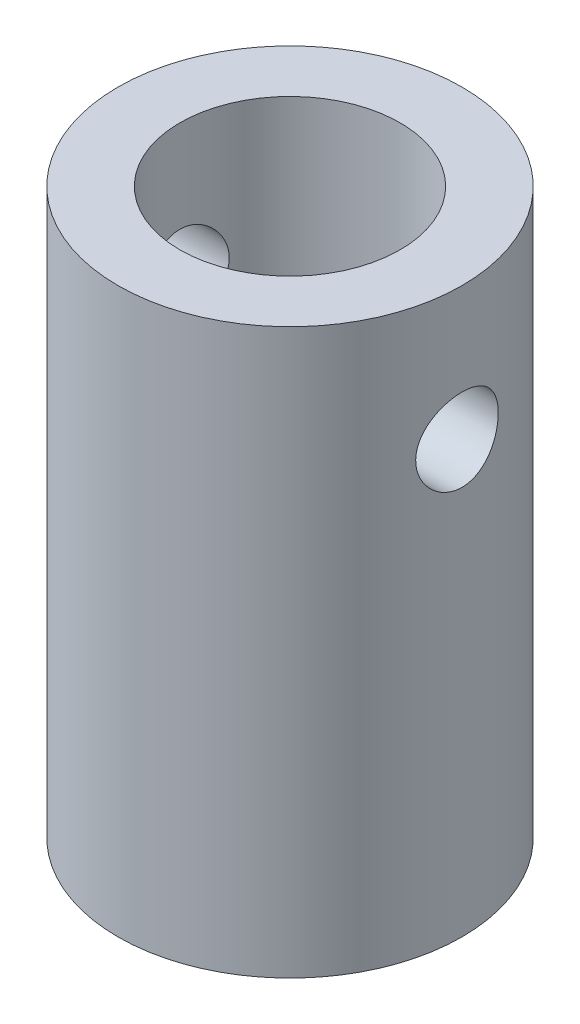
ISO-10303-21;
HEADER;
FILE_DESCRIPTION(('STEP AP214'),'2;1');
FILE_NAME('part.step','',(''),(''),'','','');
FILE_SCHEMA(('AUTOMOTIVE_DESIGN { 1 0 10303 214 1 1 1 1 }'));
ENDSEC;
DATA;
#1=APPLICATION_CONTEXT('core data for automotive mechanical design processes');
#2=APPLICATION_PROTOCOL_DEFINITION('international standard','automotive_design',2000,#1);
#3=PRODUCT_CONTEXT('',#1,'mechanical');
#4=PRODUCT('Part','Part','',(#3));
#5=PRODUCT_RELATED_PRODUCT_CATEGORY('part','',(#4));
#6=PRODUCT_DEFINITION_FORMATION('','',#4);
#7=PRODUCT_DEFINITION_CONTEXT('part definition',#1,'design');
#8=PRODUCT_DEFINITION('design','',#6,#7);
#9=PRODUCT_DEFINITION_SHAPE('','',#8);
#10=(LENGTH_UNIT() NAMED_UNIT(*) SI_UNIT(.MILLI.,.METRE.));
#11=(NAMED_UNIT(*) PLANE_ANGLE_UNIT() SI_UNIT($,.RADIAN.));
#12=(NAMED_UNIT(*) SI_UNIT($,.STERADIAN.) SOLID_ANGLE_UNIT());
#13=UNCERTAINTY_MEASURE_WITH_UNIT(LENGTH_MEASURE(1.E-05),#10,'distance_accuracy_value','');
#14=(GEOMETRIC_REPRESENTATION_CONTEXT(3) GLOBAL_UNCERTAINTY_ASSIGNED_CONTEXT((#13)) GLOBAL_UNIT_ASSIGNED_CONTEXT((#10,
#11,#12)) REPRESENTATION_CONTEXT('',''));
#15=CARTESIAN_POINT('',(0.,0.,0.));
#16=DIRECTION('',(0.,0.,1.));
#17=DIRECTION('',(1.,0.,0.));
#18=AXIS2_PLACEMENT_3D('',#15,#16,#17);
#19=CARTESIAN_POINT('',(0.,41.,0.));
#20=DIRECTION('',(0.,1.,0.));
#21=DIRECTION('',(0.,0.,1.));
#22=AXIS2_PLACEMENT_3D('',#19,#20,#21);
#23=PLANE('',#22);
#24=CARTESIAN_POINT('',(0.,41.,0.));
#25=DIRECTION('',(0.,1.,0.));
#26=DIRECTION('',(0.,0.,1.));
#27=AXIS2_PLACEMENT_3D('',#24,#25,#26);
#28=CIRCLE('',#27,12.5);
#29=CARTESIAN_POINT('',(0.,41.,12.5));
#30=VERTEX_POINT('',#29);
#31=EDGE_CURVE('E10',#30,#30,#28,.T.);
#32=ORIENTED_EDGE('',*,*,#31,.T.);
#33=EDGE_LOOP('',(#32));
#34=FACE_BOUND('',#33,.T.);
#35=CARTESIAN_POINT('',(0.,41.,0.));
#36=DIRECTION('',(0.,1.,0.));
#37=DIRECTION('',(0.,0.,1.));
#38=AXIS2_PLACEMENT_3D('',#35,#36,#37);
#39=CIRCLE('',#38,8.001);
#40=CARTESIAN_POINT('',(0.,41.,8.001));
#41=VERTEX_POINT('',#40);
#42=EDGE_CURVE('E51',#41,#41,#39,.T.);
#43=ORIENTED_EDGE('',*,*,#42,.F.);
#44=EDGE_LOOP('',(#43));
#45=FACE_BOUND('',#44,.T.);
#46=ADVANCED_FACE('F32',(#34,#45),#23,.T.);
#47=CARTESIAN_POINT('',(0.,0.,0.));
#48=DIRECTION('',(0.,1.,0.));
#49=DIRECTION('',(0.,0.,1.));
#50=AXIS2_PLACEMENT_3D('',#47,#48,#49);
#51=PLANE('',#50);
#52=CARTESIAN_POINT('',(0.,0.,0.));
#53=DIRECTION('',(0.,1.,0.));
#54=DIRECTION('',(0.,0.,1.));
#55=AXIS2_PLACEMENT_3D('',#52,#53,#54);
#56=CIRCLE('',#55,12.5);
#57=CARTESIAN_POINT('',(0.,0.,12.5));
#58=VERTEX_POINT('',#57);
#59=EDGE_CURVE('E46',#58,#58,#56,.T.);
#60=ORIENTED_EDGE('',*,*,#59,.F.);
#61=EDGE_LOOP('',(#60));
#62=FACE_BOUND('',#61,.T.);
#63=CARTESIAN_POINT('',(0.,0.,0.));
#64=DIRECTION('',(0.,1.,0.));
#65=DIRECTION('',(0.,0.,1.));
#66=AXIS2_PLACEMENT_3D('',#63,#64,#65);
#67=CIRCLE('',#66,8.001);
#68=CARTESIAN_POINT('',(0.,0.,8.001));
#69=VERTEX_POINT('',#68);
#70=EDGE_CURVE('E54',#69,#69,#67,.T.);
#71=ORIENTED_EDGE('',*,*,#70,.T.);
#72=EDGE_LOOP('',(#71));
#73=FACE_BOUND('',#72,.T.);
#74=ADVANCED_FACE('F90',(#62,#73),#51,.F.);
#75=CARTESIAN_POINT('',(0.,41.,0.));
#76=DIRECTION('',(0.,-1.,0.));
#77=DIRECTION('',(0.,0.,-1.));
#78=AXIS2_PLACEMENT_3D('',#75,#76,#77);
#79=CYLINDRICAL_SURFACE('',#78,12.5);
#80=CARTESIAN_POINT('',(-12.5,28.3,0.));
#81=CARTESIAN_POINT('',(-12.4999970714968,28.3000050240773,-0.165963929028716));
#82=CARTESIAN_POINT('',(-12.4966615634859,28.3138184102361,-0.331985420928067));
#83=CARTESIAN_POINT('',(-12.4836783946933,28.3686327395954,-0.65928429097138));
#84=CARTESIAN_POINT('',(-12.4740268462166,28.4096504279947,-0.820558683214275));
#85=CARTESIAN_POINT('',(-12.4494823208195,28.5174923345044,-1.13358839471402));
#86=CARTESIAN_POINT('',(-12.4345953702841,28.5842868898576,-1.28535442324823));
#87=CARTESIAN_POINT('',(-12.4011725442513,28.7416854364459,-1.57552517879763));
#88=CARTESIAN_POINT('',(-12.3826366165873,28.8322897680773,-1.71392971475166));
#89=CARTESIAN_POINT('',(-12.3435386014785,29.0365641783755,-1.97609263393972));
#90=CARTESIAN_POINT('',(-12.3229472454311,29.1506027810493,-2.0995595210048));
#91=CARTESIAN_POINT('',(-12.2822574370147,29.3977188690646,-2.32581080811943));
#92=CARTESIAN_POINT('',(-12.2621590363612,29.530798342041,-2.42859304624489));
#93=CARTESIAN_POINT('',(-12.224437969062,29.8144458330175,-2.61189993555015));
#94=CARTESIAN_POINT('',(-12.2068525815312,29.9652265837588,-2.69210377047565));
#95=CARTESIAN_POINT('',(-12.1765733412448,30.2786198351285,-2.82591582947333));
#96=CARTESIAN_POINT('',(-12.1638787734309,30.4412306020232,-2.87952794169564));
#97=CARTESIAN_POINT('',(-12.1451184675007,30.7704765732689,-2.95765058108663));
#98=CARTESIAN_POINT('',(-12.1389341034343,30.9369811215255,-2.98268262400617));
#99=CARTESIAN_POINT('',(-12.1335389605945,31.2719323796427,-3.00455808879087));
#100=CARTESIAN_POINT('',(-12.1343271412568,31.4403787959569,-3.00140571682399));
#101=CARTESIAN_POINT('',(-12.1426811387008,31.7704759660129,-2.96741912081942));
#102=CARTESIAN_POINT('',(-12.1500960921292,31.9321945651896,-2.93720103400494));
#103=CARTESIAN_POINT('',(-12.1706283738785,32.2481973166478,-2.85092141637189));
#104=CARTESIAN_POINT('',(-12.1837460799133,32.4024809757344,-2.79485817372027));
#105=CARTESIAN_POINT('',(-12.2143476734445,32.7009129780844,-2.65794121231782));
#106=CARTESIAN_POINT('',(-12.2318714325758,32.8449524529167,-2.5768594824696));
#107=CARTESIAN_POINT('',(-12.2692875046197,33.1176045007226,-2.39236688956383));
#108=CARTESIAN_POINT('',(-12.2891802016137,33.2462145652851,-2.28895240342647));
#109=CARTESIAN_POINT('',(-12.329732025739,33.4878935703187,-2.05951493908847));
#110=CARTESIAN_POINT('',(-12.3503975788014,33.6004670990622,-1.93297064389908));
#111=CARTESIAN_POINT('',(-12.3896951594929,33.8028847197464,-1.66255592459692));
#112=CARTESIAN_POINT('',(-12.4083271342049,33.8927282202926,-1.51868504982141));
#113=CARTESIAN_POINT('',(-12.4415394956922,34.0472972206128,-1.21702847718581));
#114=CARTESIAN_POINT('',(-12.4561077058019,34.1119474562378,-1.05920278696054));
#115=CARTESIAN_POINT('',(-12.4794620474154,34.2136650790486,-0.734497606078677));
#116=CARTESIAN_POINT('',(-12.4882491958651,34.2507373176268,-0.567619713387664));
#117=CARTESIAN_POINT('',(-12.4989027542709,34.295502064652,-0.233787399651668));
#118=CARTESIAN_POINT('',(-12.5009282130753,34.3038698924616,-0.0669284805450108));
#119=CARTESIAN_POINT('',(-12.4982807419474,34.2928332331491,0.265804381586626));
#120=CARTESIAN_POINT('',(-12.4936083648176,34.2734310380128,0.43167840476495));
#121=CARTESIAN_POINT('',(-12.4781916395217,34.2079630214836,0.755422580108844));
#122=CARTESIAN_POINT('',(-12.4675301590363,34.1622608904262,0.9133705793113));
#123=CARTESIAN_POINT('',(-12.4413335015664,34.0459018083047,1.21935330013476));
#124=CARTESIAN_POINT('',(-12.4257978558334,33.9752424570219,1.3673870666415));
#125=CARTESIAN_POINT('',(-12.3911910149582,33.8096334064022,1.6520615099557));
#126=CARTESIAN_POINT('',(-12.3720653178033,33.7142992830756,1.78847176740355));
#127=CARTESIAN_POINT('',(-12.3324936406987,33.5025430709866,2.04359904096632));
#128=CARTESIAN_POINT('',(-12.3120474520734,33.3861176439192,2.16231325074336));
#129=CARTESIAN_POINT('',(-12.2715742142771,33.1323591687915,2.38142453789941));
#130=CARTESIAN_POINT('',(-12.2515669262668,32.9946148779179,2.48134974047369));
#131=CARTESIAN_POINT('',(-12.2147538797452,32.7039095721033,2.65666020824081));
#132=CARTESIAN_POINT('',(-12.1979479778962,32.5509492389065,2.7320465722335));
#133=CARTESIAN_POINT('',(-12.1696189519335,32.234987486456,2.85558993518171));
#134=CARTESIAN_POINT('',(-12.1580647463107,32.0720517965788,2.90390754385905));
#135=CARTESIAN_POINT('',(-12.1415072663683,31.7400538149793,2.97238380283979));
#136=CARTESIAN_POINT('',(-12.1365026916888,31.5709927462382,2.99254804274991));
#137=CARTESIAN_POINT('',(-12.1337046220624,31.2363292997194,3.00387066449353));
#138=CARTESIAN_POINT('',(-12.1357241633848,31.0707535036733,2.99578106592266));
#139=CARTESIAN_POINT('',(-12.1463176460425,30.7434002357763,2.95253345626268));
#140=CARTESIAN_POINT('',(-12.1548914750658,30.5816226988886,2.91737590900097));
#141=CARTESIAN_POINT('',(-12.1775274976748,30.2672024474518,2.82138591303537));
#142=CARTESIAN_POINT('',(-12.191561756094,30.1145177274162,2.76068402045612));
#143=CARTESIAN_POINT('',(-12.2235433612686,29.8213955861163,2.61543373580583));
#144=CARTESIAN_POINT('',(-12.2414912075257,29.6809597314136,2.53088229934855));
#145=CARTESIAN_POINT('',(-12.279819325529,29.4126629998805,2.33793007708464));
#146=CARTESIAN_POINT('',(-12.3002478697533,29.2851876769013,2.22900267979018));
#147=CARTESIAN_POINT('',(-12.3409359831145,29.0500800119481,1.99143074773237));
#148=CARTESIAN_POINT('',(-12.361195511444,28.9424523367898,1.86278158874234));
#149=CARTESIAN_POINT('',(-12.3996570299581,28.7483907404453,1.5868829988014));
#150=CARTESIAN_POINT('',(-12.4178200201219,28.662331594558,1.43936414359402));
#151=CARTESIAN_POINT('',(-12.4496380610582,28.5163704672521,1.13153622828568));
#152=CARTESIAN_POINT('',(-12.4632965272855,28.4564486566084,0.971236973691226));
#153=CARTESIAN_POINT('',(-12.4824059901497,28.3739613748622,0.675887025694772));
#154=CARTESIAN_POINT('',(-12.4889599449579,28.3462833842143,0.542312066268428));
#155=CARTESIAN_POINT('',(-12.4977580149525,28.3093012191481,0.272504227478253));
#156=CARTESIAN_POINT('',(-12.5000024045682,28.2999958747745,0.136271517915779));
#157=CARTESIAN_POINT('',(-12.5,28.3,0.));
#158=B_SPLINE_CURVE_WITH_KNOTS('',3,(#80,#81,#82,#83,#84,#85,#86,#87,#88,#89,#90,#91,#92,#93,
#94,#95,#96,#97,#98,#99,#100,#101,#102,#103,#104,#105,#106,#107,#108,#109,#110,#111,#112,#113,
#114,#115,#116,#117,#118,#119,#120,#121,#122,#123,#124,#125,#126,#127,#128,#129,#130,#131,#132,
#133,#134,#135,#136,#137,#138,#139,#140,#141,#142,#143,#144,#145,#146,#147,#148,#149,#150,#151,
#152,#153,#154,#155,#156,#157),.UNSPECIFIED.,.T.,.F.,(4,2,2,2,2,2,2,2,2,2,2,2,2,2,2,2,2,2,2,2,2,
2,2,2,2,2,2,2,2,2,2,2,2,2,2,2,2,2,4),(0.,0.497392599366679,0.995091645758824,1.49221966408501,
1.98935478998519,2.49500570148357,3.00070943533307,3.51327262050849,4.02576083835037,
4.5287399535911,5.03164400680465,5.52338274964838,6.01515406709138,6.51154667521171,
7.00801987450003,7.51749958381935,8.02699254752171,8.53799614678204,9.04890983140415,
9.54771776810826,10.0464845383097,10.5385143736981,11.0305915421211,11.5308523313794,
12.031192370573,12.5427824523192,13.0543496229377,13.5628484119093,14.0712462285018,
14.5662165454702,15.0611783809799,15.5536406351284,16.0461657803879,16.5505844610431,
17.0551215958269,17.5678974206352,18.0802835459069,18.4887142303991,18.897118905514),.UNSPECIFIED.);
#159=CARTESIAN_POINT('',(-12.5,28.3,0.));
#160=VERTEX_POINT('',#159);
#161=EDGE_CURVE('E79',#160,#160,#158,.T.);
#162=ORIENTED_EDGE('',*,*,#161,.T.);
#163=EDGE_LOOP('',(#162));
#164=FACE_BOUND('',#163,.T.);
#165=CARTESIAN_POINT('',(12.1346610995116,31.3,-3.));
#166=CARTESIAN_POINT('',(12.1346643709057,31.1341136860564,-2.999994926396));
#167=CARTESIAN_POINT('',(12.1380998279897,30.9681696981776,-2.9861940157555));
#168=CARTESIAN_POINT('',(12.1514386999622,30.6410316472804,-2.93143372377318));
#169=CARTESIAN_POINT('',(12.1613461803941,30.479840636512,-2.89045727127241));
#170=CARTESIAN_POINT('',(12.1864438536979,30.1669877045971,-2.78273587845348));
#171=CARTESIAN_POINT('',(12.2016275682829,30.015314365806,-2.71602252749926));
#172=CARTESIAN_POINT('',(12.2355589227548,29.7253004563428,-2.55881551789466));
#173=CARTESIAN_POINT('',(12.2543066403104,29.5869601763305,-2.46832134098417));
#174=CARTESIAN_POINT('',(12.2936793084446,29.3247311850598,-2.26416092165145));
#175=CARTESIAN_POINT('',(12.3143323081787,29.2011528440105,-2.15010136587795));
#176=CARTESIAN_POINT('',(12.3549444196641,28.9746846055658,-1.90289576315871));
#177=CARTESIAN_POINT('',(12.3749034702238,28.8717965288074,-1.76974803831651));
#178=CARTESIAN_POINT('',(12.4121875957975,28.688373567294,-1.48603435008245));
#179=CARTESIAN_POINT('',(12.429475709008,28.6081414764507,-1.33526735140698));
#180=CARTESIAN_POINT('',(12.4591511096292,28.4742734626822,-1.0219036434405));
#181=CARTESIAN_POINT('',(12.471539061815,28.4206339318547,-0.859308542342426));
#182=CARTESIAN_POINT('',(12.4898200905274,28.3424618456135,-0.53013715279891));
#183=CARTESIAN_POINT('',(12.4958305032045,28.3174027857918,-0.363692527540999));
#184=CARTESIAN_POINT('',(12.5010873481438,28.2954524803084,-0.0288605739758579));
#185=CARTESIAN_POINT('',(12.5003347050497,28.2985573840758,0.13952648561831));
#186=CARTESIAN_POINT('',(12.4922383642801,28.332463700785,0.469819197188798));
#187=CARTESIAN_POINT('',(12.4850298487431,28.3626970841686,0.631786969117107));
#188=CARTESIAN_POINT('',(12.4649879597451,28.4490917379629,0.948279915829274));
#189=CARTESIAN_POINT('',(12.4521543006312,28.5052543251028,1.10280471220598));
#190=CARTESIAN_POINT('',(12.4220937673228,28.6423868327478,1.40154850796015));
#191=CARTESIAN_POINT('',(12.4048305309055,28.7235632557684,1.54566890739798));
#192=CARTESIAN_POINT('',(12.3677903650575,28.9082634336663,1.8184437481507));
#193=CARTESIAN_POINT('',(12.3480130295253,29.0117908007733,1.94709568430374));
#194=CARTESIAN_POINT('',(12.307523454591,29.2413154010846,2.18866676072893));
#195=CARTESIAN_POINT('',(12.2868002024656,29.367809366169,2.30111257110785));
#196=CARTESIAN_POINT('',(12.247210122564,29.6380756361584,2.50329554889259));
#197=CARTESIAN_POINT('',(12.2283433682075,29.7818486239032,2.59303181841776));
#198=CARTESIAN_POINT('',(12.1945661246798,30.0834652562631,2.74751986313759));
#199=CARTESIAN_POINT('',(12.1796724534131,30.2413650510764,2.81216594132899));
#200=CARTESIAN_POINT('',(12.155748323081,30.5662331234768,2.91385324316721));
#201=CARTESIAN_POINT('',(12.1467167199581,30.7331996246833,2.95089985341172));
#202=CARTESIAN_POINT('',(12.1357772660229,31.0670933800679,2.99556850234642));
#203=CARTESIAN_POINT('',(12.1337008786289,31.2339220725108,3.00388683328911));
#204=CARTESIAN_POINT('',(12.1364495609797,31.5665831940748,2.99276203410493));
#205=CARTESIAN_POINT('',(12.1412740503119,31.7324157058037,2.97332123871795));
#206=CARTESIAN_POINT('',(12.1571201522343,32.0558459172609,2.90783852027802));
#207=CARTESIAN_POINT('',(12.1680489760353,32.2135291759169,2.86219461484814));
#208=CARTESIAN_POINT('',(12.1947857126682,32.5190078206671,2.74603914988784));
#209=CARTESIAN_POINT('',(12.2105941678427,32.6668021054363,2.67552482603031));
#210=CARTESIAN_POINT('',(12.2456689266469,32.951278752204,2.51014743676235));
#211=CARTESIAN_POINT('',(12.2649930224287,33.087709374006,2.41486385815303));
#212=CARTESIAN_POINT('',(12.3047764880024,33.3429007338939,2.20319051610381));
#213=CARTESIAN_POINT('',(12.3252360287629,33.4616588009855,2.08679756812263));
#214=CARTESIAN_POINT('',(12.3655511140332,33.6809150096093,1.8330286051264));
#215=CARTESIAN_POINT('',(12.3853821651221,33.7809337559897,1.69523379949056));
#216=CARTESIAN_POINT('',(12.4217193399952,33.956408463085,1.40439761806721));
#217=CARTESIAN_POINT('',(12.438225632785,34.0318656724447,1.25135701785302));
#218=CARTESIAN_POINT('',(12.4659520953338,34.155447477275,0.935406182533393));
#219=CARTESIAN_POINT('',(12.4772089625634,34.2037623205216,0.772573732033522));
#220=CARTESIAN_POINT('',(12.4933282808784,34.2722678203969,0.44079751662121));
#221=CARTESIAN_POINT('',(12.4981918632553,34.2924634527555,0.271854838350958));
#222=CARTESIAN_POINT('',(12.5009346170348,34.303895867787,-0.0628273325379061));
#223=CARTESIAN_POINT('',(12.4989850590467,34.2958427559416,-0.228541548592049));
#224=CARTESIAN_POINT('',(12.4886960978661,34.2526200369824,-0.556181588106272));
#225=CARTESIAN_POINT('',(12.4803568581455,34.2174511235913,-0.718107508375785));
#226=CARTESIAN_POINT('',(12.4582475403262,34.1213631748843,-1.03289533638029));
#227=CARTESIAN_POINT('',(12.4445026408745,34.0605634305592,-1.18579554017999));
#228=CARTESIAN_POINT('',(12.4130357959962,33.9150497558514,-1.47930912419136));
#229=CARTESIAN_POINT('',(12.3953133850962,33.8303330262537,-1.61992106367531));
#230=CARTESIAN_POINT('',(12.3573152907204,33.6371745257231,-1.88826701153781));
#231=CARTESIAN_POINT('',(12.3369914041701,33.5282449292564,-2.01564306622629));
#232=CARTESIAN_POINT('',(12.2963112747441,33.2907123894103,-2.25054951565269));
#233=CARTESIAN_POINT('',(12.2759550250775,33.1621045592637,-2.35807496614236));
#234=CARTESIAN_POINT('',(12.2371275634283,32.8862606058399,-2.55199485185679));
#235=CARTESIAN_POINT('',(12.2186938455572,32.738747379493,-2.63800316633773));
#236=CARTESIAN_POINT('',(12.1862909651906,32.4309381534945,-2.78387070894251));
#237=CARTESIAN_POINT('',(12.1723183758181,32.2706520843289,-2.84375002144868));
#238=CARTESIAN_POINT('',(12.1527391085338,31.9754071464859,-2.92614436386637));
#239=CARTESIAN_POINT('',(12.1460087939348,31.8419291717888,-2.95378236710749));
#240=CARTESIAN_POINT('',(12.1369686046644,31.5723136259292,-2.99071161192546));
#241=CARTESIAN_POINT('',(12.1346584140208,31.436176245577,-3.00000416492674));
#242=CARTESIAN_POINT('',(12.1346610995116,31.3,-3.));
#243=B_SPLINE_CURVE_WITH_KNOTS('',3,(#165,#166,#167,#168,#169,#170,#171,#172,#173,#174,#175,
#176,#177,#178,#179,#180,#181,#182,#183,#184,#185,#186,#187,#188,#189,#190,#191,#192,#193,#194,
#195,#196,#197,#198,#199,#200,#201,#202,#203,#204,#205,#206,#207,#208,#209,#210,#211,#212,#213,
#214,#215,#216,#217,#218,#219,#220,#221,#222,#223,#224,#225,#226,#227,#228,#229,#230,#231,#232,
#233,#234,#235,#236,#237,#238,#239,#240,#241,#242),.UNSPECIFIED.,.T.,.F.,(4,2,2,2,2,2,2,2,2,2,2,
2,2,2,2,2,2,2,2,2,2,2,2,2,2,2,2,2,2,2,2,2,2,2,2,2,2,2,4),(0.,0.497159212189434,
0.994631026538901,1.49149417875254,1.98836816009861,2.49432418194046,3.00032470584734,
3.51279830766303,4.02520236141813,4.52800628486068,5.03074146609936,5.52318961529223,
6.01566277459448,6.51231571921414,7.00904899016388,7.51819168467208,8.02735450631452,
8.53863957226521,9.04982482437227,9.54852995993759,10.047193153326,10.5384749824062,
11.0298114342859,11.5301065260645,12.0304771548043,12.5422844123508,13.0540656468818,
13.5622134292334,14.0702712827588,14.5656502933719,15.0610166307768,15.5541024543049,
16.047246011943,16.5514085771014,17.0556965465884,17.56847227941,18.0808531634825,
18.4890008491296,18.8971193572843),.UNSPECIFIED.);
#244=CARTESIAN_POINT('',(12.1346610995116,31.3,-3.));
#245=VERTEX_POINT('',#244);
#246=EDGE_CURVE('E74',#245,#245,#243,.T.);
#247=ORIENTED_EDGE('',*,*,#246,.T.);
#248=EDGE_LOOP('',(#247));
#249=FACE_BOUND('',#248,.T.);
#250=ORIENTED_EDGE('',*,*,#31,.F.);
#251=EDGE_LOOP('',(#250));
#252=FACE_BOUND('',#251,.T.);
#253=ORIENTED_EDGE('',*,*,#59,.T.);
#254=EDGE_LOOP('',(#253));
#255=FACE_BOUND('',#254,.T.);
#256=ADVANCED_FACE('F34',(#164,#249,#252,#255),#79,.T.);
#257=CARTESIAN_POINT('',(0.,41.,0.));
#258=DIRECTION('',(0.,-1.,0.));
#259=DIRECTION('',(0.,0.,-1.));
#260=AXIS2_PLACEMENT_3D('',#257,#258,#259);
#261=CYLINDRICAL_SURFACE('',#260,8.001);
#262=CARTESIAN_POINT('',(-7.41727719584485,31.3,-3.));
#263=CARTESIAN_POINT('',(-7.41727152861232,31.4620166319951,-3.00000607473563));
#264=CARTESIAN_POINT('',(-7.42264324216956,31.6239932166987,-2.98683167921588));
#265=CARTESIAN_POINT('',(-7.44339865614759,31.9430629979412,-2.93472236326252));
#266=CARTESIAN_POINT('',(-7.45878205868589,32.1001563396278,-2.89578820927056));
#267=CARTESIAN_POINT('',(-7.49757850447422,32.4047628638339,-2.79378847822149));
#268=CARTESIAN_POINT('',(-7.52097229896198,32.5522980129644,-2.73078070777986));
#269=CARTESIAN_POINT('',(-7.57312262888379,32.8347609575816,-2.58262707862275));
#270=CARTESIAN_POINT('',(-7.60188077394861,32.9696849506674,-2.49747457211146));
#271=CARTESIAN_POINT('',(-7.66312052670176,33.229800271511,-2.30291681759619));
#272=CARTESIAN_POINT('',(-7.69571166271351,33.3542763816324,-2.19258958290271));
#273=CARTESIAN_POINT('',(-7.76003143571703,33.5834638979379,-1.95277038576581));
#274=CARTESIAN_POINT('',(-7.79175988755618,33.688171089459,-1.82327434707642));
#275=CARTESIAN_POINT('',(-7.85208127483671,33.8782937087188,-1.54336468174618));
#276=CARTESIAN_POINT('',(-7.88053083183528,33.9629317119534,-1.39238934225915));
#277=CARTESIAN_POINT('',(-7.92977234745378,34.1053113877947,-1.07708781320688));
#278=CARTESIAN_POINT('',(-7.95056696062198,34.163062386003,-0.912766275952249));
#279=CARTESIAN_POINT('',(-7.98137805830044,34.2475202753126,-0.582956108888999));
#280=CARTESIAN_POINT('',(-7.99182066081076,34.2754584946925,-0.417823382702862));
#281=CARTESIAN_POINT('',(-8.0022803778127,34.3034430787544,-0.0849051609686334));
#282=CARTESIAN_POINT('',(-8.00230088155185,34.3034985108679,0.0828794544397013));
#283=CARTESIAN_POINT('',(-7.99218514675229,34.2764330623407,0.407512868600751));
#284=CARTESIAN_POINT('',(-7.98255122268873,34.2506562190626,0.564492095970201));
#285=CARTESIAN_POINT('',(-7.95486789319488,34.1749187802072,0.871709814964829));
#286=CARTESIAN_POINT('',(-7.93681789185623,34.1249564721455,1.02194782844604));
#287=CARTESIAN_POINT('',(-7.89376301567912,34.0016417787652,1.31401391857534));
#288=CARTESIAN_POINT('',(-7.86866076407029,33.9279596293035,1.45568781575188));
#289=CARTESIAN_POINT('',(-7.81404157946822,33.7595887771719,1.72501198518963));
#290=CARTESIAN_POINT('',(-7.78452322359773,33.6648932991976,1.85265771447036));
#291=CARTESIAN_POINT('',(-7.72207629970282,33.4507082210682,2.09821917076727));
#292=CARTESIAN_POINT('',(-7.6890492533502,33.3300922713404,2.21512891995141));
#293=CARTESIAN_POINT('',(-7.62468804361794,33.0707689451673,2.42744084436011));
#294=CARTESIAN_POINT('',(-7.59335430668241,32.9320570411767,2.52283762076017));
#295=CARTESIAN_POINT('',(-7.53530688107876,32.6365105324541,2.69133726783766));
#296=CARTESIAN_POINT('',(-7.50871111298896,32.479342139758,2.76389858248041));
#297=CARTESIAN_POINT('',(-7.46451485470958,32.1537569664183,2.88114420438391));
#298=CARTESIAN_POINT('',(-7.44690936154409,31.9853465009805,2.92584401928397));
#299=CARTESIAN_POINT('',(-7.42386731026289,31.6519982801139,2.98380973425916));
#300=CARTESIAN_POINT('',(-7.41781305683342,31.4873814151229,2.99867358590269));
#301=CARTESIAN_POINT('',(-7.41681053592766,31.1579302963424,3.0011553163756));
#302=CARTESIAN_POINT('',(-7.42185949412822,30.9930961071403,2.98878000136569));
#303=CARTESIAN_POINT('',(-7.44186720732821,30.6760866811312,2.93858347763765));
#304=CARTESIAN_POINT('',(-7.45634434883024,30.5236819090611,2.90199760598706));
#305=CARTESIAN_POINT('',(-7.49300608322328,30.2272441812063,2.80597275846335));
#306=CARTESIAN_POINT('',(-7.51519225488619,30.0832129473399,2.74652910116069));
#307=CARTESIAN_POINT('',(-7.56579498360875,29.801607461013,2.60396937186406));
#308=CARTESIAN_POINT('',(-7.59441387915003,29.6644775051291,2.5200496047291));
#309=CARTESIAN_POINT('',(-7.65431728932393,29.4056785505203,2.33177497385777));
#310=CARTESIAN_POINT('',(-7.68560277697683,29.2840152361558,2.22741263258533));
#311=CARTESIAN_POINT('',(-7.74971026332596,29.0516051182255,1.99338912124166));
#312=CARTESIAN_POINT('',(-7.78250398595298,28.9420387711745,1.86254380916898));
#313=CARTESIAN_POINT('',(-7.8440326360357,28.7462769150197,1.58352020673327));
#314=CARTESIAN_POINT('',(-7.87276755057215,28.660081480305,1.43534186120173));
#315=CARTESIAN_POINT('',(-7.92292103164439,28.5140753834928,1.12595209186483));
#316=CARTESIAN_POINT('',(-7.94436461639002,28.4541742893367,0.964787630566901));
#317=CARTESIAN_POINT('',(-7.9775981263831,28.3626696905744,0.633682412258213));
#318=CARTESIAN_POINT('',(-7.98939258677087,28.3310528915433,0.463745818170284));
#319=CARTESIAN_POINT('',(-8.00156942006889,28.2984476272494,0.130590193370929));
#320=CARTESIAN_POINT('',(-8.00257669918876,28.2957818790842,-0.0324433064536547));
#321=CARTESIAN_POINT('',(-7.99469491142916,28.3168401486282,-0.356536151684332));
#322=CARTESIAN_POINT('',(-7.98580703760051,28.3405609849273,-0.517595732717402));
#323=CARTESIAN_POINT('',(-7.9594183224408,28.4125416067279,-0.829180214090448));
#324=CARTESIAN_POINT('',(-7.94213279035423,28.4601889132499,-0.97986623117283));
#325=CARTESIAN_POINT('',(-7.90075452600728,28.5780600573199,-1.27111699664131));
#326=CARTESIAN_POINT('',(-7.87666050527276,28.6482881685249,-1.41167982293728));
#327=CARTESIAN_POINT('',(-7.82281677862304,28.8126854274021,-1.68516550261008));
#328=CARTESIAN_POINT('',(-7.79287192120438,28.9077367854662,-1.81751891049336));
#329=CARTESIAN_POINT('',(-7.73100364756802,29.1176912490938,-2.0649147780936));
#330=CARTESIAN_POINT('',(-7.69907952780303,29.2326014399099,-2.17995103187828));
#331=CARTESIAN_POINT('',(-7.63478858332373,29.4862203877348,-2.39569404575333));
#332=CARTESIAN_POINT('',(-7.60248727349156,29.6258649208016,-2.495324497391));
#333=CARTESIAN_POINT('',(-7.54300830034396,29.920934764367,-2.6697474127832));
#334=CARTESIAN_POINT('',(-7.51583116624653,30.0763617023036,-2.7445373116456));
#335=CARTESIAN_POINT('',(-7.46910579035165,30.4060044011095,-2.86934556083818));
#336=CARTESIAN_POINT('',(-7.44994315803456,30.5807445861998,-2.91813754568091));
#337=CARTESIAN_POINT('',(-7.42403612797078,30.9370096303653,-2.9834507257726));
#338=CARTESIAN_POINT('',(-7.4172835435453,31.1185299360099,-2.9999931958673));
#339=CARTESIAN_POINT('',(-7.41727719584485,31.3,-3.));
#340=B_SPLINE_CURVE_WITH_KNOTS('',3,(#262,#263,#264,#265,#266,#267,#268,#269,#270,#271,#272,
#273,#274,#275,#276,#277,#278,#279,#280,#281,#282,#283,#284,#285,#286,#287,#288,#289,#290,#291,
#292,#293,#294,#295,#296,#297,#298,#299,#300,#301,#302,#303,#304,#305,#306,#307,#308,#309,#310,
#311,#312,#313,#314,#315,#316,#317,#318,#319,#320,#321,#322,#323,#324,#325,#326,#327,#328,#329,
#330,#331,#332,#333,#334,#335,#336,#337,#338,#339),.UNSPECIFIED.,.T.,.F.,(4,2,2,2,2,2,2,2,2,2,2,
2,2,2,2,2,2,2,2,2,2,2,2,2,2,2,2,2,2,2,2,2,2,2,2,2,2,2,4),(0.,0.485374153382876,
0.970733865860037,1.4549353626011,1.93928238358022,2.44551407167193,2.95185356498662,
3.47541747701689,3.99879965840716,4.49961189730641,5.00026127287427,5.47614793080257,
5.9520682894572,6.43491362918331,6.91791487900089,7.42917047020772,7.94055422199872,
8.46328329032157,8.9857211485622,9.47934011968844,9.97283576587247,10.4429138134737,
10.9130881875693,11.4008836338623,11.8888578415147,12.4077569559684,12.9266577220475,
13.4437596175605,13.9606183325474,14.4473611989686,14.9340453855402,15.408861936858,
15.8837684051991,16.3786359310651,16.8736803821002,17.3948446394308,17.9160626924583,
18.460075008862,19.0037283214194),.UNSPECIFIED.);
#341=CARTESIAN_POINT('',(-7.41727719584485,31.3,-3.));
#342=VERTEX_POINT('',#341);
#343=EDGE_CURVE('E37',#342,#342,#340,.T.);
#344=ORIENTED_EDGE('',*,*,#343,.F.);
#345=EDGE_LOOP('',(#344));
#346=FACE_BOUND('',#345,.T.);
#347=CARTESIAN_POINT('',(7.41727719584485,31.3,-3.));
#348=CARTESIAN_POINT('',(7.41727152861232,31.1379833680049,-3.00000607473563));
#349=CARTESIAN_POINT('',(7.42264324216956,30.9760067833013,-2.98683167921588));
#350=CARTESIAN_POINT('',(7.44339865614759,30.6569370020588,-2.93472236326252));
#351=CARTESIAN_POINT('',(7.45878205868589,30.4998436603722,-2.89578820927056));
#352=CARTESIAN_POINT('',(7.49757850447422,30.1952371361661,-2.79378847822149));
#353=CARTESIAN_POINT('',(7.52097229896198,30.0477019870356,-2.73078070777986));
#354=CARTESIAN_POINT('',(7.57312262888379,29.7652390424184,-2.58262707862275));
#355=CARTESIAN_POINT('',(7.60188077394861,29.6303150493326,-2.49747457211146));
#356=CARTESIAN_POINT('',(7.66312052670176,29.370199728489,-2.30291681759619));
#357=CARTESIAN_POINT('',(7.69571166271351,29.2457236183676,-2.19258958290271));
#358=CARTESIAN_POINT('',(7.76003143571703,29.0165361020621,-1.95277038576581));
#359=CARTESIAN_POINT('',(7.79175988755618,28.911828910541,-1.82327434707642));
#360=CARTESIAN_POINT('',(7.85208127483671,28.7217062912812,-1.54336468174618));
#361=CARTESIAN_POINT('',(7.88053083183528,28.6370682880466,-1.39238934225915));
#362=CARTESIAN_POINT('',(7.92977234745378,28.4946886122053,-1.07708781320688));
#363=CARTESIAN_POINT('',(7.95056696062198,28.436937613997,-0.912766275952249));
#364=CARTESIAN_POINT('',(7.98137805830044,28.3524797246874,-0.582956108889));
#365=CARTESIAN_POINT('',(7.99182066081076,28.3245415053075,-0.417823382702863));
#366=CARTESIAN_POINT('',(8.0022803778127,28.2965569212455,-0.0849051609686334));
#367=CARTESIAN_POINT('',(8.00230088155185,28.2965014891321,0.0828794544397014));
#368=CARTESIAN_POINT('',(7.99218514675229,28.3235669376593,0.407512868600751));
#369=CARTESIAN_POINT('',(7.98255122268873,28.3493437809374,0.5644920959702));
#370=CARTESIAN_POINT('',(7.95486789319488,28.4250812197928,0.871709814964828));
#371=CARTESIAN_POINT('',(7.93681789185623,28.4750435278545,1.02194782844604));
#372=CARTESIAN_POINT('',(7.89376301567912,28.5983582212348,1.31401391857534));
#373=CARTESIAN_POINT('',(7.86866076407029,28.6720403706965,1.45568781575188));
#374=CARTESIAN_POINT('',(7.81404157946822,28.8404112228281,1.72501198518963));
#375=CARTESIAN_POINT('',(7.78452322359773,28.9351067008025,1.85265771447035));
#376=CARTESIAN_POINT('',(7.72207629970282,29.1492917789318,2.09821917076727));
#377=CARTESIAN_POINT('',(7.6890492533502,29.2699077286596,2.21512891995141));
#378=CARTESIAN_POINT('',(7.62468804361794,29.5292310548327,2.42744084436011));
#379=CARTESIAN_POINT('',(7.59335430668241,29.6679429588233,2.52283762076017));
#380=CARTESIAN_POINT('',(7.53530688107875,29.9634894675459,2.69133726783766));
#381=CARTESIAN_POINT('',(7.50871111298896,30.120657860242,2.76389858248041));
#382=CARTESIAN_POINT('',(7.46451485470958,30.4462430335817,2.88114420438391));
#383=CARTESIAN_POINT('',(7.44690936154409,30.6146534990195,2.92584401928397));
#384=CARTESIAN_POINT('',(7.42386731026289,30.9480017198861,2.98380973425916));
#385=CARTESIAN_POINT('',(7.41781305683342,31.1126185848771,2.99867358590269));
#386=CARTESIAN_POINT('',(7.41681053592766,31.4420697036576,3.0011553163756));
#387=CARTESIAN_POINT('',(7.42185949412822,31.6069038928597,2.98878000136569));
#388=CARTESIAN_POINT('',(7.44186720732821,31.9239133188688,2.93858347763765));
#389=CARTESIAN_POINT('',(7.45634434883024,32.0763180909389,2.90199760598706));
#390=CARTESIAN_POINT('',(7.49300608322328,32.3727558187937,2.80597275846335));
#391=CARTESIAN_POINT('',(7.51519225488619,32.5167870526601,2.7465291011607));
#392=CARTESIAN_POINT('',(7.56579498360875,32.798392538987,2.60396937186406));
#393=CARTESIAN_POINT('',(7.59441387915003,32.9355224948709,2.5200496047291));
#394=CARTESIAN_POINT('',(7.65431728932393,33.1943214494797,2.33177497385777));
#395=CARTESIAN_POINT('',(7.68560277697683,33.3159847638442,2.22741263258533));
#396=CARTESIAN_POINT('',(7.74971026332596,33.5483948817745,1.99338912124166));
#397=CARTESIAN_POINT('',(7.78250398595298,33.6579612288255,1.86254380916897));
#398=CARTESIAN_POINT('',(7.8440326360357,33.8537230849803,1.58352020673327));
#399=CARTESIAN_POINT('',(7.87276755057215,33.939918519695,1.43534186120173));
#400=CARTESIAN_POINT('',(7.92292103164439,34.0859246165072,1.12595209186483));
#401=CARTESIAN_POINT('',(7.94436461639002,34.1458257106633,0.9647876305669));
#402=CARTESIAN_POINT('',(7.9775981263831,34.2373303094256,0.633682412258213));
#403=CARTESIAN_POINT('',(7.98939258677087,34.2689471084567,0.463745818170285));
#404=CARTESIAN_POINT('',(8.00156942006889,34.3015523727506,0.130590193370932));
#405=CARTESIAN_POINT('',(8.00257669918876,34.3042181209158,-0.0324433064536513));
#406=CARTESIAN_POINT('',(7.99469491142916,34.2831598513718,-0.356536151684329));
#407=CARTESIAN_POINT('',(7.98580703760051,34.2594390150727,-0.5175957327174));
#408=CARTESIAN_POINT('',(7.9594183224408,34.1874583932721,-0.829180214090446));
#409=CARTESIAN_POINT('',(7.94213279035423,34.1398110867501,-0.979866231172828));
#410=CARTESIAN_POINT('',(7.90075452600728,34.0219399426801,-1.2711169966413));
#411=CARTESIAN_POINT('',(7.87666050527276,33.9517118314751,-1.41167982293728));
#412=CARTESIAN_POINT('',(7.82281677862304,33.7873145725979,-1.68516550261008));
#413=CARTESIAN_POINT('',(7.79287192120438,33.6922632145338,-1.81751891049335));
#414=CARTESIAN_POINT('',(7.73100364756802,33.4823087509062,-2.0649147780936));
#415=CARTESIAN_POINT('',(7.69907952780303,33.3673985600901,-2.17995103187828));
#416=CARTESIAN_POINT('',(7.63478858332373,33.1137796122652,-2.39569404575333));
#417=CARTESIAN_POINT('',(7.60248727349156,32.9741350791984,-2.495324497391));
#418=CARTESIAN_POINT('',(7.54300830034397,32.679065235633,-2.6697474127832));
#419=CARTESIAN_POINT('',(7.51583116624654,32.5236382976964,-2.7445373116456));
#420=CARTESIAN_POINT('',(7.46910579035165,32.1939955988905,-2.86934556083818));
#421=CARTESIAN_POINT('',(7.44994315803456,32.0192554138002,-2.91813754568091));
#422=CARTESIAN_POINT('',(7.42403612797078,31.6629903696347,-2.9834507257726));
#423=CARTESIAN_POINT('',(7.4172835435453,31.4814700639901,-2.9999931958673));
#424=CARTESIAN_POINT('',(7.41727719584485,31.3,-3.));
#425=B_SPLINE_CURVE_WITH_KNOTS('',3,(#347,#348,#349,#350,#351,#352,#353,#354,#355,#356,#357,
#358,#359,#360,#361,#362,#363,#364,#365,#366,#367,#368,#369,#370,#371,#372,#373,#374,#375,#376,
#377,#378,#379,#380,#381,#382,#383,#384,#385,#386,#387,#388,#389,#390,#391,#392,#393,#394,#395,
#396,#397,#398,#399,#400,#401,#402,#403,#404,#405,#406,#407,#408,#409,#410,#411,#412,#413,#414,
#415,#416,#417,#418,#419,#420,#421,#422,#423,#424),.UNSPECIFIED.,.T.,.F.,(4,2,2,2,2,2,2,2,2,2,2,
2,2,2,2,2,2,2,2,2,2,2,2,2,2,2,2,2,2,2,2,2,2,2,2,2,2,2,4),(0.,0.485374153382876,
0.970733865860037,1.4549353626011,1.93928238358021,2.44551407167193,2.95185356498662,
3.47541747701689,3.99879965840716,4.49961189730641,5.00026127287427,5.47614793080257,
5.9520682894572,6.43491362918331,6.91791487900089,7.42917047020773,7.94055422199872,
8.46328329032158,8.9857211485622,9.47934011968844,9.97283576587247,10.4429138134737,
10.9130881875693,11.4008836338623,11.8888578415147,12.4077569559684,12.9266577220475,
13.4437596175605,13.9606183325474,14.4473611989686,14.9340453855402,15.408861936858,
15.8837684051991,16.3786359310651,16.8736803821002,17.3948446394308,17.9160626924583,
18.460075008862,19.0037283214194),.UNSPECIFIED.);
#426=CARTESIAN_POINT('',(7.41727719584485,31.3,-3.));
#427=VERTEX_POINT('',#426);
#428=EDGE_CURVE('E56',#427,#427,#425,.T.);
#429=ORIENTED_EDGE('',*,*,#428,.F.);
#430=EDGE_LOOP('',(#429));
#431=FACE_BOUND('',#430,.T.);
#432=ORIENTED_EDGE('',*,*,#42,.T.);
#433=EDGE_LOOP('',(#432));
#434=FACE_BOUND('',#433,.T.);
#435=ORIENTED_EDGE('',*,*,#70,.F.);
#436=EDGE_LOOP('',(#435));
#437=FACE_BOUND('',#436,.T.);
#438=ADVANCED_FACE('F61',(#346,#431,#434,#437),#261,.F.);
#439=CARTESIAN_POINT('',(-12.5,31.3,0.));
#440=DIRECTION('',(1.,0.,0.));
#441=DIRECTION('',(0.,0.,-1.));
#442=AXIS2_PLACEMENT_3D('',#439,#440,#441);
#443=CYLINDRICAL_SURFACE('',#442,3.);
#444=ORIENTED_EDGE('',*,*,#428,.T.);
#445=EDGE_LOOP('',(#444));
#446=FACE_BOUND('',#445,.T.);
#447=ORIENTED_EDGE('',*,*,#246,.F.);
#448=EDGE_LOOP('',(#447));
#449=FACE_BOUND('',#448,.T.);
#450=ADVANCED_FACE('F67',(#446,#449),#443,.F.);
#451=ORIENTED_EDGE('',*,*,#343,.T.);
#452=EDGE_LOOP('',(#451));
#453=FACE_BOUND('',#452,.T.);
#454=ORIENTED_EDGE('',*,*,#161,.F.);
#455=EDGE_LOOP('',(#454));
#456=FACE_BOUND('',#455,.T.);
#457=ADVANCED_FACE('F64',(#453,#456),#443,.F.);
#458=CLOSED_SHELL('',(#46,#74,#256,#438,#450,#457));
#459=MANIFOLD_SOLID_BREP('B2',#458);
#460=ADVANCED_BREP_SHAPE_REPRESENTATION('',(#18,#459),#14);
#461=SHAPE_DEFINITION_REPRESENTATION(#9,#460);
ENDSEC;
END-ISO-10303-21;
